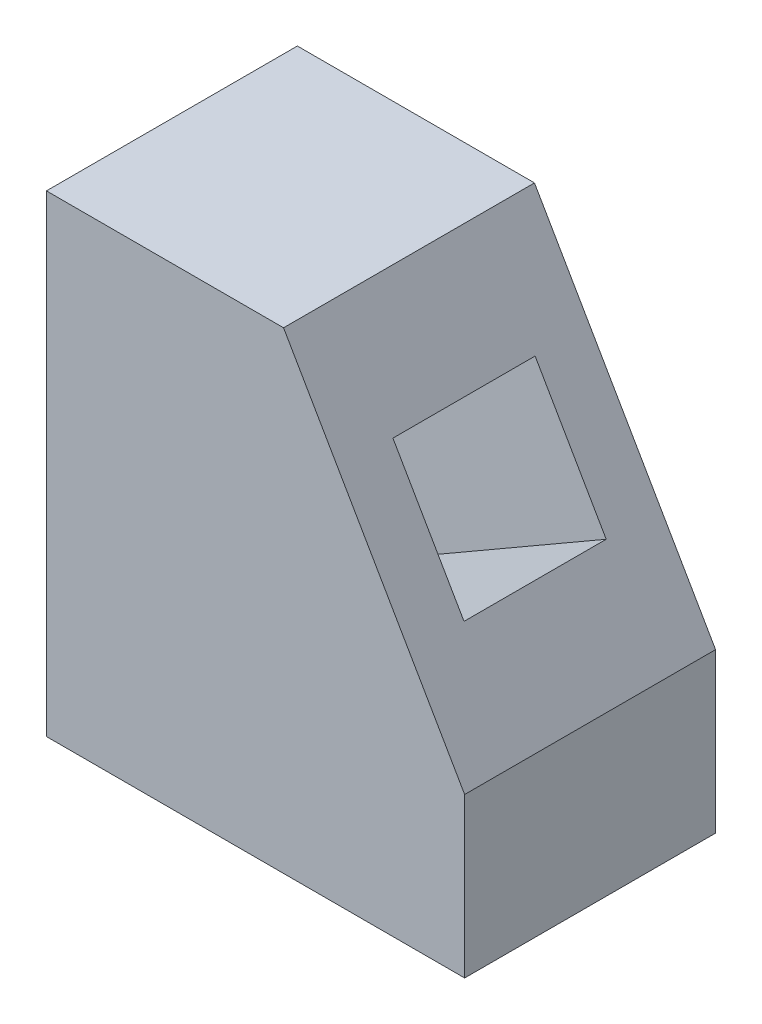
ISO-10303-21;
HEADER;
FILE_DESCRIPTION(('STEP AP214'),'2;1');
FILE_NAME('part.step','',(''),(''),'','','');
FILE_SCHEMA(('AUTOMOTIVE_DESIGN { 1 0 10303 214 1 1 1 1 }'));
ENDSEC;
DATA;
#1=APPLICATION_CONTEXT('core data for automotive mechanical design processes');
#2=APPLICATION_PROTOCOL_DEFINITION('international standard','automotive_design',2000,#1);
#3=PRODUCT_CONTEXT('',#1,'mechanical');
#4=PRODUCT('Part','Part','',(#3));
#5=PRODUCT_RELATED_PRODUCT_CATEGORY('part','',(#4));
#6=PRODUCT_DEFINITION_FORMATION('','',#4);
#7=PRODUCT_DEFINITION_CONTEXT('part definition',#1,'design');
#8=PRODUCT_DEFINITION('design','',#6,#7);
#9=PRODUCT_DEFINITION_SHAPE('','',#8);
#10=(LENGTH_UNIT() NAMED_UNIT(*) SI_UNIT(.MILLI.,.METRE.));
#11=(NAMED_UNIT(*) PLANE_ANGLE_UNIT() SI_UNIT($,.RADIAN.));
#12=(NAMED_UNIT(*) SI_UNIT($,.STERADIAN.) SOLID_ANGLE_UNIT());
#13=UNCERTAINTY_MEASURE_WITH_UNIT(LENGTH_MEASURE(1.E-05),#10,'distance_accuracy_value','');
#14=(GEOMETRIC_REPRESENTATION_CONTEXT(3) GLOBAL_UNCERTAINTY_ASSIGNED_CONTEXT((#13)) GLOBAL_UNIT_ASSIGNED_CONTEXT((#10,
#11,#12)) REPRESENTATION_CONTEXT('',''));
#15=CARTESIAN_POINT('',(0.,0.,0.));
#16=DIRECTION('',(0.,0.,1.));
#17=DIRECTION('',(1.,0.,0.));
#18=AXIS2_PLACEMENT_3D('',#15,#16,#17);
#19=CARTESIAN_POINT('',(0.,11.3,0.));
#20=DIRECTION('',(1.,0.,0.));
#21=DIRECTION('',(0.,0.,-1.));
#22=AXIS2_PLACEMENT_3D('',#19,#20,#21);
#23=PLANE('',#22);
#24=DIRECTION('',(0.,0.,1.));
#25=VECTOR('',#24,1.);
#26=CARTESIAN_POINT('',(0.,0.,0.));
#27=LINE('',#26,#25);
#28=CARTESIAN_POINT('',(0.,0.,-6.));
#29=VERTEX_POINT('',#28);
#30=CARTESIAN_POINT('',(0.,0.,0.));
#31=VERTEX_POINT('',#30);
#32=EDGE_CURVE('E156',#29,#31,#27,.T.);
#33=ORIENTED_EDGE('',*,*,#32,.T.);
#34=DIRECTION('',(0.,-1.,0.));
#35=VECTOR('',#34,1.);
#36=CARTESIAN_POINT('',(0.,11.3,0.));
#37=LINE('',#36,#35);
#38=CARTESIAN_POINT('',(0.,11.3,0.));
#39=VERTEX_POINT('',#38);
#40=EDGE_CURVE('E11',#39,#31,#37,.T.);
#41=ORIENTED_EDGE('',*,*,#40,.F.);
#42=DIRECTION('',(0.,0.,1.));
#43=VECTOR('',#42,1.);
#44=CARTESIAN_POINT('',(0.,11.3,0.));
#45=LINE('',#44,#43);
#46=CARTESIAN_POINT('',(0.,11.3,-6.));
#47=VERTEX_POINT('',#46);
#48=EDGE_CURVE('E163',#47,#39,#45,.T.);
#49=ORIENTED_EDGE('',*,*,#48,.F.);
#50=DIRECTION('',(0.,-1.,0.));
#51=VECTOR('',#50,1.);
#52=CARTESIAN_POINT('',(0.,11.3,-6.));
#53=LINE('',#52,#51);
#54=EDGE_CURVE('E167',#47,#29,#53,.T.);
#55=ORIENTED_EDGE('',*,*,#54,.T.);
#56=EDGE_LOOP('',(#33,#41,#49,#55));
#57=FACE_BOUND('',#56,.T.);
#58=ADVANCED_FACE('F41',(#57),#23,.F.);
#59=CARTESIAN_POINT('',(0.,11.3,0.));
#60=DIRECTION('',(0.,0.,-1.));
#61=DIRECTION('',(-1.,0.,0.));
#62=AXIS2_PLACEMENT_3D('',#59,#60,#61);
#63=PLANE('',#62);
#64=DIRECTION('',(0.,-1.,0.));
#65=VECTOR('',#64,1.);
#66=CARTESIAN_POINT('',(10.,11.3,0.));
#67=LINE('',#66,#65);
#68=CARTESIAN_POINT('',(10.,3.8,0.));
#69=VERTEX_POINT('',#68);
#70=CARTESIAN_POINT('',(10.,0.,0.));
#71=VERTEX_POINT('',#70);
#72=EDGE_CURVE('E48',#69,#71,#67,.T.);
#73=ORIENTED_EDGE('',*,*,#72,.F.);
#74=DIRECTION('',(0.499999999999995,-0.866025403784442,0.));
#75=VECTOR('',#74,1.);
#76=CARTESIAN_POINT('',(10.,3.8,0.));
#77=LINE('',#76,#75);
#78=CARTESIAN_POINT('',(5.66987298107787,11.3,0.));
#79=VERTEX_POINT('',#78);
#80=EDGE_CURVE('E159',#79,#69,#77,.T.);
#81=ORIENTED_EDGE('',*,*,#80,.F.);
#82=DIRECTION('',(1.,0.,0.));
#83=VECTOR('',#82,1.);
#84=CARTESIAN_POINT('',(0.,11.3,0.));
#85=LINE('',#84,#83);
#86=EDGE_CURVE('E165',#39,#79,#85,.T.);
#87=ORIENTED_EDGE('',*,*,#86,.F.);
#88=ORIENTED_EDGE('',*,*,#40,.T.);
#89=DIRECTION('',(1.,0.,0.));
#90=VECTOR('',#89,1.);
#91=CARTESIAN_POINT('',(0.,0.,0.));
#92=LINE('',#91,#90);
#93=EDGE_CURVE('E173',#31,#71,#92,.T.);
#94=ORIENTED_EDGE('',*,*,#93,.T.);
#95=EDGE_LOOP('',(#73,#81,#87,#88,#94));
#96=FACE_BOUND('',#95,.T.);
#97=ADVANCED_FACE('F191',(#96),#63,.F.);
#98=CARTESIAN_POINT('',(10.,11.3,0.));
#99=DIRECTION('',(-1.,0.,0.));
#100=DIRECTION('',(0.,0.,1.));
#101=AXIS2_PLACEMENT_3D('',#98,#99,#100);
#102=PLANE('',#101);
#103=DIRECTION('',(0.,-1.,0.));
#104=VECTOR('',#103,1.);
#105=CARTESIAN_POINT('',(10.,11.3,-6.));
#106=LINE('',#105,#104);
#107=CARTESIAN_POINT('',(10.,3.8,-6.));
#108=VERTEX_POINT('',#107);
#109=CARTESIAN_POINT('',(10.,0.,-6.));
#110=VERTEX_POINT('',#109);
#111=EDGE_CURVE('E185',#108,#110,#106,.T.);
#112=ORIENTED_EDGE('',*,*,#111,.F.);
#113=DIRECTION('',(0.,0.,-1.));
#114=VECTOR('',#113,1.);
#115=CARTESIAN_POINT('',(10.,3.8,0.00100000000000013));
#116=LINE('',#115,#114);
#117=EDGE_CURVE('E154',#69,#108,#116,.T.);
#118=ORIENTED_EDGE('',*,*,#117,.F.);
#119=ORIENTED_EDGE('',*,*,#72,.T.);
#120=DIRECTION('',(0.,0.,-1.));
#121=VECTOR('',#120,1.);
#122=CARTESIAN_POINT('',(10.,0.,0.));
#123=LINE('',#122,#121);
#124=EDGE_CURVE('E176',#71,#110,#123,.T.);
#125=ORIENTED_EDGE('',*,*,#124,.T.);
#126=EDGE_LOOP('',(#112,#118,#119,#125));
#127=FACE_BOUND('',#126,.T.);
#128=ADVANCED_FACE('F190',(#127),#102,.F.);
#129=CARTESIAN_POINT('',(0.,11.3,-6.));
#130=DIRECTION('',(0.,0.,1.));
#131=DIRECTION('',(1.,0.,0.));
#132=AXIS2_PLACEMENT_3D('',#129,#130,#131);
#133=PLANE('',#132);
#134=DIRECTION('',(-1.,0.,0.));
#135=VECTOR('',#134,1.);
#136=CARTESIAN_POINT('',(0.,11.3,-6.));
#137=LINE('',#136,#135);
#138=CARTESIAN_POINT('',(5.66987298107787,11.3,-6.));
#139=VERTEX_POINT('',#138);
#140=EDGE_CURVE('E166',#139,#47,#137,.T.);
#141=ORIENTED_EDGE('',*,*,#140,.F.);
#142=DIRECTION('',(-0.499999999999995,0.866025403784442,0.));
#143=VECTOR('',#142,1.);
#144=CARTESIAN_POINT('',(10.,3.8,-6.));
#145=LINE('',#144,#143);
#146=EDGE_CURVE('E65',#108,#139,#145,.T.);
#147=ORIENTED_EDGE('',*,*,#146,.F.);
#148=ORIENTED_EDGE('',*,*,#111,.T.);
#149=DIRECTION('',(-1.,0.,0.));
#150=VECTOR('',#149,1.);
#151=CARTESIAN_POINT('',(0.,0.,-6.));
#152=LINE('',#151,#150);
#153=EDGE_CURVE('E164',#110,#29,#152,.T.);
#154=ORIENTED_EDGE('',*,*,#153,.T.);
#155=ORIENTED_EDGE('',*,*,#54,.F.);
#156=EDGE_LOOP('',(#141,#147,#148,#154,#155));
#157=FACE_BOUND('',#156,.T.);
#158=ADVANCED_FACE('F197',(#157),#133,.F.);
#159=CARTESIAN_POINT('',(0.,11.3,0.));
#160=DIRECTION('',(0.,-1.,0.));
#161=DIRECTION('',(0.,0.,-1.));
#162=AXIS2_PLACEMENT_3D('',#159,#160,#161);
#163=PLANE('',#162);
#164=ORIENTED_EDGE('',*,*,#86,.T.);
#165=DIRECTION('',(0.,0.,-1.));
#166=VECTOR('',#165,1.);
#167=CARTESIAN_POINT('',(5.66987298107787,11.3,0.00100000000000013));
#168=LINE('',#167,#166);
#169=EDGE_CURVE('E152',#79,#139,#168,.T.);
#170=ORIENTED_EDGE('',*,*,#169,.T.);
#171=ORIENTED_EDGE('',*,*,#140,.T.);
#172=ORIENTED_EDGE('',*,*,#48,.T.);
#173=EDGE_LOOP('',(#164,#170,#171,#172));
#174=FACE_BOUND('',#173,.T.);
#175=ADVANCED_FACE('F205',(#174),#163,.F.);
#176=CARTESIAN_POINT('',(0.,0.,0.));
#177=DIRECTION('',(0.,-1.,0.));
#178=DIRECTION('',(0.,0.,-1.));
#179=AXIS2_PLACEMENT_3D('',#176,#177,#178);
#180=PLANE('',#179);
#181=CARTESIAN_POINT('',(5.,0.,-3.));
#182=DIRECTION('',(0.,-1.,0.));
#183=DIRECTION('',(0.,0.,-1.));
#184=AXIS2_PLACEMENT_3D('',#181,#182,#183);
#185=CIRCLE('',#184,0.5);
#186=CARTESIAN_POINT('',(5.,0.,-3.5));
#187=VERTEX_POINT('',#186);
#188=EDGE_CURVE('E139',#187,#187,#185,.T.);
#189=ORIENTED_EDGE('',*,*,#188,.F.);
#190=EDGE_LOOP('',(#189));
#191=FACE_BOUND('',#190,.T.);
#192=ORIENTED_EDGE('',*,*,#32,.F.);
#193=ORIENTED_EDGE('',*,*,#153,.F.);
#194=ORIENTED_EDGE('',*,*,#124,.F.);
#195=ORIENTED_EDGE('',*,*,#93,.F.);
#196=EDGE_LOOP('',(#192,#193,#194,#195));
#197=FACE_BOUND('',#196,.T.);
#198=ADVANCED_FACE('F198',(#191,#197),#180,.T.);
#199=CARTESIAN_POINT('',(10.,3.8,0.00100000000000013));
#200=DIRECTION('',(-0.866025403784442,-0.499999999999995,0.));
#201=DIRECTION('',(0.499999999999995,-0.866025403784442,0.));
#202=AXIS2_PLACEMENT_3D('',#199,#200,#201);
#203=PLANE('',#202);
#204=DIRECTION('',(-0.499999999999995,0.866025403784442,0.));
#205=VECTOR('',#204,1.);
#206=CARTESIAN_POINT('',(6.98493649053895,9.02224318643355,-4.7));
#207=LINE('',#206,#205);
#208=CARTESIAN_POINT('',(8.68493649053893,6.07775681356644,-4.7));
#209=VERTEX_POINT('',#208);
#210=CARTESIAN_POINT('',(6.98493649053895,9.02224318643355,-4.7));
#211=VERTEX_POINT('',#210);
#212=EDGE_CURVE('E141',#209,#211,#207,.T.);
#213=ORIENTED_EDGE('',*,*,#212,.F.);
#214=DIRECTION('',(0.,0.,-1.));
#215=VECTOR('',#214,1.);
#216=CARTESIAN_POINT('',(8.68493649053893,6.07775681356645,-4.7));
#217=LINE('',#216,#215);
#218=CARTESIAN_POINT('',(8.68493649053893,6.07775681356645,-1.3));
#219=VERTEX_POINT('',#218);
#220=EDGE_CURVE('E54',#219,#209,#217,.T.);
#221=ORIENTED_EDGE('',*,*,#220,.F.);
#222=DIRECTION('',(0.499999999999995,-0.866025403784442,0.));
#223=VECTOR('',#222,1.);
#224=CARTESIAN_POINT('',(6.98493649053895,9.02224318643355,-1.3));
#225=LINE('',#224,#223);
#226=CARTESIAN_POINT('',(6.98493649053895,9.02224318643355,-1.3));
#227=VERTEX_POINT('',#226);
#228=EDGE_CURVE('E133',#227,#219,#225,.T.);
#229=ORIENTED_EDGE('',*,*,#228,.F.);
#230=DIRECTION('',(0.,0.,1.));
#231=VECTOR('',#230,1.);
#232=CARTESIAN_POINT('',(6.98493649053895,9.02224318643355,-4.7));
#233=LINE('',#232,#231);
#234=EDGE_CURVE('E134',#211,#227,#233,.T.);
#235=ORIENTED_EDGE('',*,*,#234,.F.);
#236=EDGE_LOOP('',(#213,#221,#229,#235));
#237=FACE_BOUND('',#236,.T.);
#238=ORIENTED_EDGE('',*,*,#80,.T.);
#239=ORIENTED_EDGE('',*,*,#117,.T.);
#240=ORIENTED_EDGE('',*,*,#146,.T.);
#241=ORIENTED_EDGE('',*,*,#169,.F.);
#242=EDGE_LOOP('',(#238,#239,#240,#241));
#243=FACE_BOUND('',#242,.T.);
#244=ADVANCED_FACE('F201',(#237,#243),#203,.F.);
#245=CARTESIAN_POINT('',(1.7567332602634,2.07775681356649,-4.7));
#246=DIRECTION('',(0.499999999999995,-0.866025403784442,0.));
#247=DIRECTION('',(0.866025403784442,0.499999999999995,0.));
#248=AXIS2_PLACEMENT_3D('',#245,#246,#247);
#249=PLANE('',#248);
#250=ORIENTED_EDGE('',*,*,#220,.T.);
#251=DIRECTION('',(0.866025403784442,0.499999999999995,0.));
#252=VECTOR('',#251,1.);
#253=CARTESIAN_POINT('',(1.7567332602634,2.07775681356649,-4.7));
#254=LINE('',#253,#252);
#255=CARTESIAN_POINT('',(1.7567332602634,2.07775681356649,-4.7));
#256=VERTEX_POINT('',#255);
#257=EDGE_CURVE('E107',#256,#209,#254,.T.);
#258=ORIENTED_EDGE('',*,*,#257,.F.);
#259=DIRECTION('',(0.,0.,-1.));
#260=VECTOR('',#259,1.);
#261=CARTESIAN_POINT('',(1.7567332602634,2.07775681356649,-4.7));
#262=LINE('',#261,#260);
#263=CARTESIAN_POINT('',(1.7567332602634,2.07775681356649,-1.3));
#264=VERTEX_POINT('',#263);
#265=EDGE_CURVE('E113',#264,#256,#262,.T.);
#266=ORIENTED_EDGE('',*,*,#265,.F.);
#267=DIRECTION('',(0.866025403784442,0.499999999999995,0.));
#268=VECTOR('',#267,1.);
#269=CARTESIAN_POINT('',(1.7567332602634,2.07775681356649,-1.3));
#270=LINE('',#269,#268);
#271=EDGE_CURVE('E150',#264,#219,#270,.T.);
#272=ORIENTED_EDGE('',*,*,#271,.T.);
#273=EDGE_LOOP('',(#250,#258,#266,#272));
#274=FACE_BOUND('',#273,.T.);
#275=ADVANCED_FACE('F111',(#274),#249,.F.);
#276=CARTESIAN_POINT('',(0.0567332602634148,5.0222431864336,-1.3));
#277=DIRECTION('',(0.,0.,1.));
#278=DIRECTION('',(0.,-1.,0.));
#279=AXIS2_PLACEMENT_3D('',#276,#277,#278);
#280=PLANE('',#279);
#281=ORIENTED_EDGE('',*,*,#228,.T.);
#282=ORIENTED_EDGE('',*,*,#271,.F.);
#283=DIRECTION('',(0.499999999999995,-0.866025403784442,0.));
#284=VECTOR('',#283,1.);
#285=CARTESIAN_POINT('',(0.0567332602634148,5.0222431864336,-1.3));
#286=LINE('',#285,#284);
#287=CARTESIAN_POINT('',(0.0567332602634148,5.0222431864336,-1.3));
#288=VERTEX_POINT('',#287);
#289=EDGE_CURVE('E118',#288,#264,#286,.T.);
#290=ORIENTED_EDGE('',*,*,#289,.F.);
#291=DIRECTION('',(0.866025403784442,0.499999999999995,0.));
#292=VECTOR('',#291,1.);
#293=CARTESIAN_POINT('',(0.0567332602634148,5.0222431864336,-1.3));
#294=LINE('',#293,#292);
#295=EDGE_CURVE('E147',#288,#227,#294,.T.);
#296=ORIENTED_EDGE('',*,*,#295,.T.);
#297=EDGE_LOOP('',(#281,#282,#290,#296));
#298=FACE_BOUND('',#297,.T.);
#299=ADVANCED_FACE('F215',(#298),#280,.F.);
#300=CARTESIAN_POINT('',(0.0567332602634148,5.0222431864336,-4.7));
#301=DIRECTION('',(-0.499999999999995,0.866025403784442,0.));
#302=DIRECTION('',(-0.866025403784442,-0.499999999999995,0.));
#303=AXIS2_PLACEMENT_3D('',#300,#301,#302);
#304=PLANE('',#303);
#305=ORIENTED_EDGE('',*,*,#234,.T.);
#306=ORIENTED_EDGE('',*,*,#295,.F.);
#307=DIRECTION('',(0.,0.,1.));
#308=VECTOR('',#307,1.);
#309=CARTESIAN_POINT('',(0.0567332602634148,5.0222431864336,-4.7));
#310=LINE('',#309,#308);
#311=CARTESIAN_POINT('',(0.0567332602634148,5.0222431864336,-4.7));
#312=VERTEX_POINT('',#311);
#313=EDGE_CURVE('E126',#312,#288,#310,.T.);
#314=ORIENTED_EDGE('',*,*,#313,.F.);
#315=DIRECTION('',(0.866025403784442,0.499999999999995,0.));
#316=VECTOR('',#315,1.);
#317=CARTESIAN_POINT('',(0.0567332602634148,5.0222431864336,-4.7));
#318=LINE('',#317,#316);
#319=EDGE_CURVE('E117',#312,#211,#318,.T.);
#320=ORIENTED_EDGE('',*,*,#319,.T.);
#321=EDGE_LOOP('',(#305,#306,#314,#320));
#322=FACE_BOUND('',#321,.T.);
#323=ADVANCED_FACE('F274',(#322),#304,.F.);
#324=CARTESIAN_POINT('',(0.0567332602634148,5.0222431864336,-4.7));
#325=DIRECTION('',(0.,0.,-1.));
#326=DIRECTION('',(-1.,0.,0.));
#327=AXIS2_PLACEMENT_3D('',#324,#325,#326);
#328=PLANE('',#327);
#329=ORIENTED_EDGE('',*,*,#212,.T.);
#330=ORIENTED_EDGE('',*,*,#319,.F.);
#331=DIRECTION('',(-0.499999999999995,0.866025403784442,0.));
#332=VECTOR('',#331,1.);
#333=CARTESIAN_POINT('',(0.0567332602634148,5.0222431864336,-4.7));
#334=LINE('',#333,#332);
#335=EDGE_CURVE('E125',#256,#312,#334,.T.);
#336=ORIENTED_EDGE('',*,*,#335,.F.);
#337=ORIENTED_EDGE('',*,*,#257,.T.);
#338=EDGE_LOOP('',(#329,#330,#336,#337));
#339=FACE_BOUND('',#338,.T.);
#340=ADVANCED_FACE('F124',(#339),#328,.F.);
#341=CARTESIAN_POINT('',(2.21724503691495,1.28012701892219,0.));
#342=DIRECTION('',(0.866025403784442,0.499999999999995,0.));
#343=DIRECTION('',(-0.499999999999995,0.866025403784442,0.));
#344=AXIS2_PLACEMENT_3D('',#341,#342,#343);
#345=PLANE('',#344);
#346=ORIENTED_EDGE('',*,*,#265,.T.);
#347=ORIENTED_EDGE('',*,*,#335,.T.);
#348=ORIENTED_EDGE('',*,*,#313,.T.);
#349=ORIENTED_EDGE('',*,*,#289,.T.);
#350=EDGE_LOOP('',(#346,#347,#348,#349));
#351=FACE_BOUND('',#350,.T.);
#352=ADVANCED_FACE('F128',(#351),#345,.T.);
#353=CARTESIAN_POINT('',(5.,0.1,-3.));
#354=DIRECTION('',(0.,-1.,0.));
#355=DIRECTION('',(0.,0.,-1.));
#356=AXIS2_PLACEMENT_3D('',#353,#354,#355);
#357=CYLINDRICAL_SURFACE('',#356,0.5);
#358=CARTESIAN_POINT('',(5.,0.1,-3.));
#359=DIRECTION('',(0.,-1.,0.));
#360=DIRECTION('',(0.,0.,-1.));
#361=AXIS2_PLACEMENT_3D('',#358,#359,#360);
#362=CIRCLE('',#361,0.5);
#363=CARTESIAN_POINT('',(5.,0.1,-3.5));
#364=VERTEX_POINT('',#363);
#365=EDGE_CURVE('E144',#364,#364,#362,.T.);
#366=ORIENTED_EDGE('',*,*,#365,.F.);
#367=EDGE_LOOP('',(#366));
#368=FACE_BOUND('',#367,.T.);
#369=ORIENTED_EDGE('',*,*,#188,.T.);
#370=EDGE_LOOP('',(#369));
#371=FACE_BOUND('',#370,.T.);
#372=ADVANCED_FACE('F296',(#368,#371),#357,.F.);
#373=CARTESIAN_POINT('',(5.,0.1,-3.));
#374=DIRECTION('',(0.,-1.,0.));
#375=DIRECTION('',(0.,0.,-1.));
#376=AXIS2_PLACEMENT_3D('',#373,#374,#375);
#377=PLANE('',#376);
#378=ORIENTED_EDGE('',*,*,#365,.T.);
#379=EDGE_LOOP('',(#378));
#380=FACE_BOUND('',#379,.T.);
#381=ADVANCED_FACE('F306',(#380),#377,.T.);
#382=CLOSED_SHELL('',(#58,#97,#128,#158,#175,#198,#244,#275,#299,#323,#340,#352,#372,#381));
#383=MANIFOLD_SOLID_BREP('B2',#382);
#384=ADVANCED_BREP_SHAPE_REPRESENTATION('',(#18,#383),#14);
#385=SHAPE_DEFINITION_REPRESENTATION(#9,#384);
ENDSEC;
END-ISO-10303-21;
